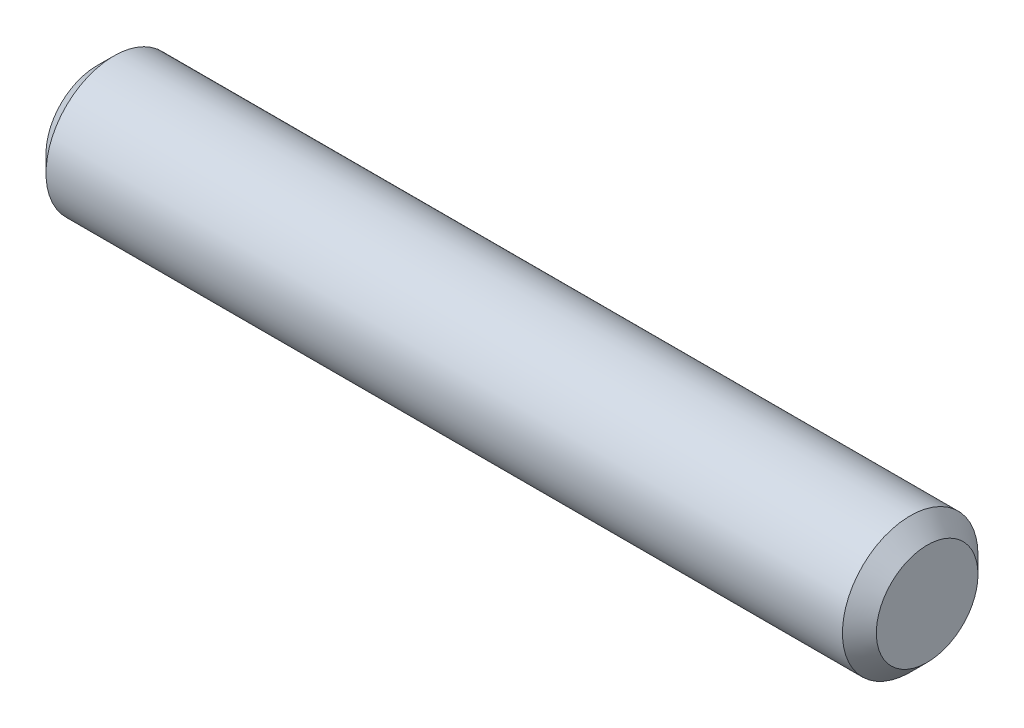
ISO-10303-21;
HEADER;
FILE_DESCRIPTION(('STEP AP214'),'2;1');
FILE_NAME('part.step','',(''),(''),'','','');
FILE_SCHEMA(('AUTOMOTIVE_DESIGN { 1 0 10303 214 1 1 1 1 }'));
ENDSEC;
DATA;
#1=APPLICATION_CONTEXT('core data for automotive mechanical design processes');
#2=APPLICATION_PROTOCOL_DEFINITION('international standard','automotive_design',2000,#1);
#3=PRODUCT_CONTEXT('',#1,'mechanical');
#4=PRODUCT('Part','Part','',(#3));
#5=PRODUCT_RELATED_PRODUCT_CATEGORY('part','',(#4));
#6=PRODUCT_DEFINITION_FORMATION('','',#4);
#7=PRODUCT_DEFINITION_CONTEXT('part definition',#1,'design');
#8=PRODUCT_DEFINITION('design','',#6,#7);
#9=PRODUCT_DEFINITION_SHAPE('','',#8);
#10=(LENGTH_UNIT() NAMED_UNIT(*) SI_UNIT(.MILLI.,.METRE.));
#11=(NAMED_UNIT(*) PLANE_ANGLE_UNIT() SI_UNIT($,.RADIAN.));
#12=(NAMED_UNIT(*) SI_UNIT($,.STERADIAN.) SOLID_ANGLE_UNIT());
#13=UNCERTAINTY_MEASURE_WITH_UNIT(LENGTH_MEASURE(1.E-05),#10,'distance_accuracy_value','');
#14=(GEOMETRIC_REPRESENTATION_CONTEXT(3) GLOBAL_UNCERTAINTY_ASSIGNED_CONTEXT((#13)) GLOBAL_UNIT_ASSIGNED_CONTEXT((#10,
#11,#12)) REPRESENTATION_CONTEXT('',''));
#15=CARTESIAN_POINT('',(0.,0.,0.));
#16=DIRECTION('',(0.,0.,1.));
#17=DIRECTION('',(1.,0.,0.));
#18=AXIS2_PLACEMENT_3D('',#15,#16,#17);
#19=CARTESIAN_POINT('',(24.5,0.,0.));
#20=DIRECTION('',(-1.,0.,0.));
#21=DIRECTION('',(0.,0.,1.));
#22=AXIS2_PLACEMENT_3D('',#19,#20,#21);
#23=CYLINDRICAL_SURFACE('',#22,4.);
#24=CARTESIAN_POINT('',(-23.5,0.,0.));
#25=DIRECTION('',(1.,0.,0.));
#26=DIRECTION('',(0.,0.,-1.));
#27=AXIS2_PLACEMENT_3D('',#24,#25,#26);
#28=CIRCLE('',#27,4.);
#29=CARTESIAN_POINT('',(-23.5,0.,-4.));
#30=VERTEX_POINT('',#29);
#31=EDGE_CURVE('E49',#30,#30,#28,.T.);
#32=ORIENTED_EDGE('',*,*,#31,.T.);
#33=EDGE_LOOP('',(#32));
#34=FACE_BOUND('',#33,.T.);
#35=CARTESIAN_POINT('',(23.5,0.,0.));
#36=DIRECTION('',(1.,0.,0.));
#37=DIRECTION('',(0.,0.,-1.));
#38=AXIS2_PLACEMENT_3D('',#35,#36,#37);
#39=CIRCLE('',#38,4.);
#40=CARTESIAN_POINT('',(23.5,0.,-4.));
#41=VERTEX_POINT('',#40);
#42=EDGE_CURVE('E53',#41,#41,#39,.F.);
#43=ORIENTED_EDGE('',*,*,#42,.T.);
#44=EDGE_LOOP('',(#43));
#45=FACE_BOUND('',#44,.T.);
#46=ADVANCED_FACE('F37',(#34,#45),#23,.T.);
#47=CARTESIAN_POINT('',(24.5,0.,0.));
#48=DIRECTION('',(1.,0.,0.));
#49=DIRECTION('',(0.,0.,-1.));
#50=AXIS2_PLACEMENT_3D('',#47,#48,#49);
#51=PLANE('',#50);
#52=CARTESIAN_POINT('',(24.5,0.,0.));
#53=DIRECTION('',(1.,0.,0.));
#54=DIRECTION('',(0.,0.,-1.));
#55=AXIS2_PLACEMENT_3D('',#52,#53,#54);
#56=CIRCLE('',#55,3.);
#57=CARTESIAN_POINT('',(24.5,0.,-3.));
#58=VERTEX_POINT('',#57);
#59=EDGE_CURVE('E10',#58,#58,#56,.T.);
#60=ORIENTED_EDGE('',*,*,#59,.T.);
#61=EDGE_LOOP('',(#60));
#62=FACE_BOUND('',#61,.T.);
#63=ADVANCED_FACE('F69',(#62),#51,.T.);
#64=CARTESIAN_POINT('',(-24.5,0.,0.));
#65=DIRECTION('',(1.,0.,0.));
#66=DIRECTION('',(0.,0.,-1.));
#67=AXIS2_PLACEMENT_3D('',#64,#65,#66);
#68=PLANE('',#67);
#69=CARTESIAN_POINT('',(-24.5,0.,0.));
#70=DIRECTION('',(1.,0.,0.));
#71=DIRECTION('',(0.,0.,-1.));
#72=AXIS2_PLACEMENT_3D('',#69,#70,#71);
#73=CIRCLE('',#72,2.99999999999999);
#74=CARTESIAN_POINT('',(-24.5,0.,-2.99999999999999));
#75=VERTEX_POINT('',#74);
#76=EDGE_CURVE('E45',#75,#75,#73,.F.);
#77=ORIENTED_EDGE('',*,*,#76,.T.);
#78=EDGE_LOOP('',(#77));
#79=FACE_BOUND('',#78,.T.);
#80=ADVANCED_FACE('F66',(#79),#68,.F.);
#81=CARTESIAN_POINT('',(-23.5,0.,0.));
#82=DIRECTION('',(1.,0.,0.));
#83=DIRECTION('',(0.,0.,-1.));
#84=AXIS2_PLACEMENT_3D('',#81,#82,#83);
#85=CONICAL_SURFACE('',#84,4.,0.785398163397454);
#86=ORIENTED_EDGE('',*,*,#76,.F.);
#87=EDGE_LOOP('',(#86));
#88=FACE_BOUND('',#87,.T.);
#89=ORIENTED_EDGE('',*,*,#31,.F.);
#90=EDGE_LOOP('',(#89));
#91=FACE_BOUND('',#90,.T.);
#92=ADVANCED_FACE('F62',(#88,#91),#85,.T.);
#93=CARTESIAN_POINT('',(24.5,0.,0.));
#94=DIRECTION('',(-1.,0.,0.));
#95=DIRECTION('',(0.,0.,1.));
#96=AXIS2_PLACEMENT_3D('',#93,#94,#95);
#97=CONICAL_SURFACE('',#96,3.,0.785398163397445);
#98=ORIENTED_EDGE('',*,*,#42,.F.);
#99=EDGE_LOOP('',(#98));
#100=FACE_BOUND('',#99,.T.);
#101=ORIENTED_EDGE('',*,*,#59,.F.);
#102=EDGE_LOOP('',(#101));
#103=FACE_BOUND('',#102,.T.);
#104=ADVANCED_FACE('F40',(#100,#103),#97,.T.);
#105=CLOSED_SHELL('',(#46,#63,#80,#92,#104));
#106=MANIFOLD_SOLID_BREP('B2',#105);
#107=ADVANCED_BREP_SHAPE_REPRESENTATION('',(#18,#106),#14);
#108=SHAPE_DEFINITION_REPRESENTATION(#9,#107);
ENDSEC;
END-ISO-10303-21;
